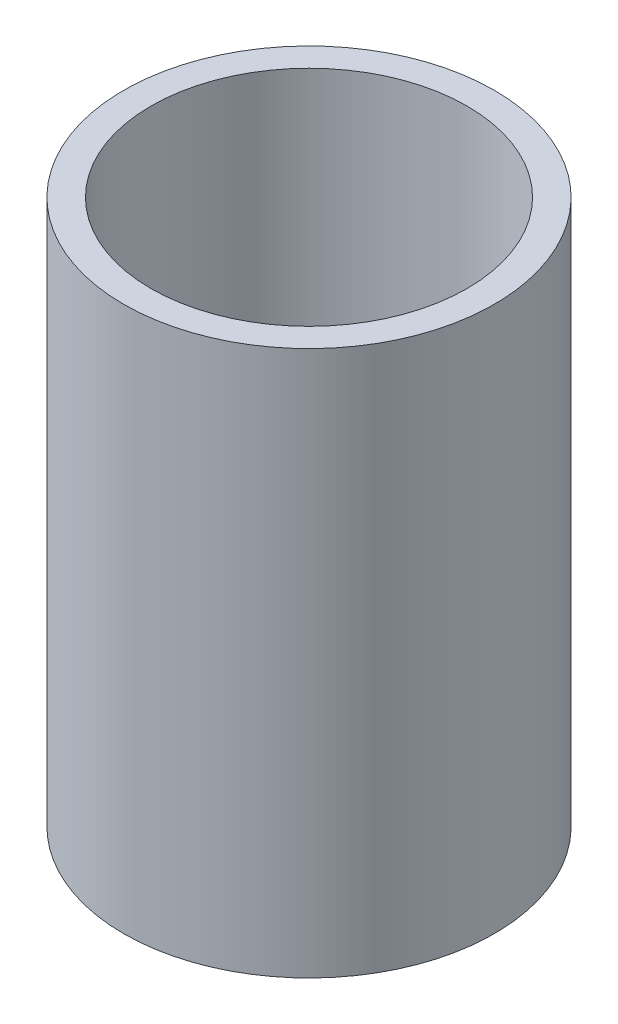
ISO-10303-21;
HEADER;
FILE_DESCRIPTION(('STEP AP214'),'2;1');
FILE_NAME('part.step','',(''),(''),'','','');
FILE_SCHEMA(('AUTOMOTIVE_DESIGN { 1 0 10303 214 1 1 1 1 }'));
ENDSEC;
DATA;
#1=APPLICATION_CONTEXT('core data for automotive mechanical design processes');
#2=APPLICATION_PROTOCOL_DEFINITION('international standard','automotive_design',2000,#1);
#3=PRODUCT_CONTEXT('',#1,'mechanical');
#4=PRODUCT('Part','Part','',(#3));
#5=PRODUCT_RELATED_PRODUCT_CATEGORY('part','',(#4));
#6=PRODUCT_DEFINITION_FORMATION('','',#4);
#7=PRODUCT_DEFINITION_CONTEXT('part definition',#1,'design');
#8=PRODUCT_DEFINITION('design','',#6,#7);
#9=PRODUCT_DEFINITION_SHAPE('','',#8);
#10=(LENGTH_UNIT() NAMED_UNIT(*) SI_UNIT(.MILLI.,.METRE.));
#11=(NAMED_UNIT(*) PLANE_ANGLE_UNIT() SI_UNIT($,.RADIAN.));
#12=(NAMED_UNIT(*) SI_UNIT($,.STERADIAN.) SOLID_ANGLE_UNIT());
#13=UNCERTAINTY_MEASURE_WITH_UNIT(LENGTH_MEASURE(1.E-05),#10,'distance_accuracy_value','');
#14=(GEOMETRIC_REPRESENTATION_CONTEXT(3) GLOBAL_UNCERTAINTY_ASSIGNED_CONTEXT((#13)) GLOBAL_UNIT_ASSIGNED_CONTEXT((#10,
#11,#12)) REPRESENTATION_CONTEXT('',''));
#15=CARTESIAN_POINT('',(0.,0.,0.));
#16=DIRECTION('',(0.,0.,1.));
#17=DIRECTION('',(1.,0.,0.));
#18=AXIS2_PLACEMENT_3D('',#15,#16,#17);
#19=CARTESIAN_POINT('',(0.,100.,0.));
#20=DIRECTION('',(0.,-1.,0.));
#21=DIRECTION('',(0.,0.,-1.));
#22=AXIS2_PLACEMENT_3D('',#19,#20,#21);
#23=CYLINDRICAL_SURFACE('',#22,34.);
#24=CARTESIAN_POINT('',(0.,100.,0.));
#25=DIRECTION('',(0.,1.,0.));
#26=DIRECTION('',(0.,0.,1.));
#27=AXIS2_PLACEMENT_3D('',#24,#25,#26);
#28=CIRCLE('',#27,34.);
#29=CARTESIAN_POINT('',(0.,100.,34.));
#30=VERTEX_POINT('',#29);
#31=EDGE_CURVE('E10',#30,#30,#28,.T.);
#32=ORIENTED_EDGE('',*,*,#31,.F.);
#33=EDGE_LOOP('',(#32));
#34=FACE_BOUND('',#33,.T.);
#35=CARTESIAN_POINT('',(0.,0.,0.));
#36=DIRECTION('',(0.,1.,0.));
#37=DIRECTION('',(0.,0.,1.));
#38=AXIS2_PLACEMENT_3D('',#35,#36,#37);
#39=CIRCLE('',#38,34.);
#40=CARTESIAN_POINT('',(0.,0.,34.));
#41=VERTEX_POINT('',#40);
#42=EDGE_CURVE('E40',#41,#41,#39,.T.);
#43=ORIENTED_EDGE('',*,*,#42,.T.);
#44=EDGE_LOOP('',(#43));
#45=FACE_BOUND('',#44,.T.);
#46=ADVANCED_FACE('F37',(#34,#45),#23,.T.);
#47=CARTESIAN_POINT('',(0.,100.,0.));
#48=DIRECTION('',(0.,1.,0.));
#49=DIRECTION('',(0.,0.,1.));
#50=AXIS2_PLACEMENT_3D('',#47,#48,#49);
#51=PLANE('',#50);
#52=CARTESIAN_POINT('',(0.,100.,0.));
#53=DIRECTION('',(0.,1.,0.));
#54=DIRECTION('',(0.,0.,1.));
#55=AXIS2_PLACEMENT_3D('',#52,#53,#54);
#56=CIRCLE('',#55,29.);
#57=CARTESIAN_POINT('',(0.,100.,29.));
#58=VERTEX_POINT('',#57);
#59=EDGE_CURVE('E51',#58,#58,#56,.T.);
#60=ORIENTED_EDGE('',*,*,#59,.F.);
#61=EDGE_LOOP('',(#60));
#62=FACE_BOUND('',#61,.T.);
#63=ORIENTED_EDGE('',*,*,#31,.T.);
#64=EDGE_LOOP('',(#63));
#65=FACE_BOUND('',#64,.T.);
#66=ADVANCED_FACE('F68',(#62,#65),#51,.T.);
#67=CARTESIAN_POINT('',(0.,0.,0.));
#68=DIRECTION('',(0.,1.,0.));
#69=DIRECTION('',(0.,0.,1.));
#70=AXIS2_PLACEMENT_3D('',#67,#68,#69);
#71=PLANE('',#70);
#72=CARTESIAN_POINT('',(0.,0.,0.));
#73=DIRECTION('',(0.,1.,0.));
#74=DIRECTION('',(0.,0.,1.));
#75=AXIS2_PLACEMENT_3D('',#72,#73,#74);
#76=CIRCLE('',#75,29.);
#77=CARTESIAN_POINT('',(0.,0.,29.));
#78=VERTEX_POINT('',#77);
#79=EDGE_CURVE('E49',#78,#78,#76,.T.);
#80=ORIENTED_EDGE('',*,*,#79,.T.);
#81=EDGE_LOOP('',(#80));
#82=FACE_BOUND('',#81,.T.);
#83=ORIENTED_EDGE('',*,*,#42,.F.);
#84=EDGE_LOOP('',(#83));
#85=FACE_BOUND('',#84,.T.);
#86=ADVANCED_FACE('F59',(#82,#85),#71,.F.);
#87=CARTESIAN_POINT('',(0.,0.,0.));
#88=DIRECTION('',(0.,1.,0.));
#89=DIRECTION('',(0.,0.,1.));
#90=AXIS2_PLACEMENT_3D('',#87,#88,#89);
#91=CYLINDRICAL_SURFACE('',#90,29.);
#92=ORIENTED_EDGE('',*,*,#79,.F.);
#93=EDGE_LOOP('',(#92));
#94=FACE_BOUND('',#93,.T.);
#95=ORIENTED_EDGE('',*,*,#59,.T.);
#96=EDGE_LOOP('',(#95));
#97=FACE_BOUND('',#96,.T.);
#98=ADVANCED_FACE('F62',(#94,#97),#91,.F.);
#99=CLOSED_SHELL('',(#46,#66,#86,#98));
#100=MANIFOLD_SOLID_BREP('B2',#99);
#101=ADVANCED_BREP_SHAPE_REPRESENTATION('',(#18,#100),#14);
#102=SHAPE_DEFINITION_REPRESENTATION(#9,#101);
ENDSEC;
END-ISO-10303-21;
